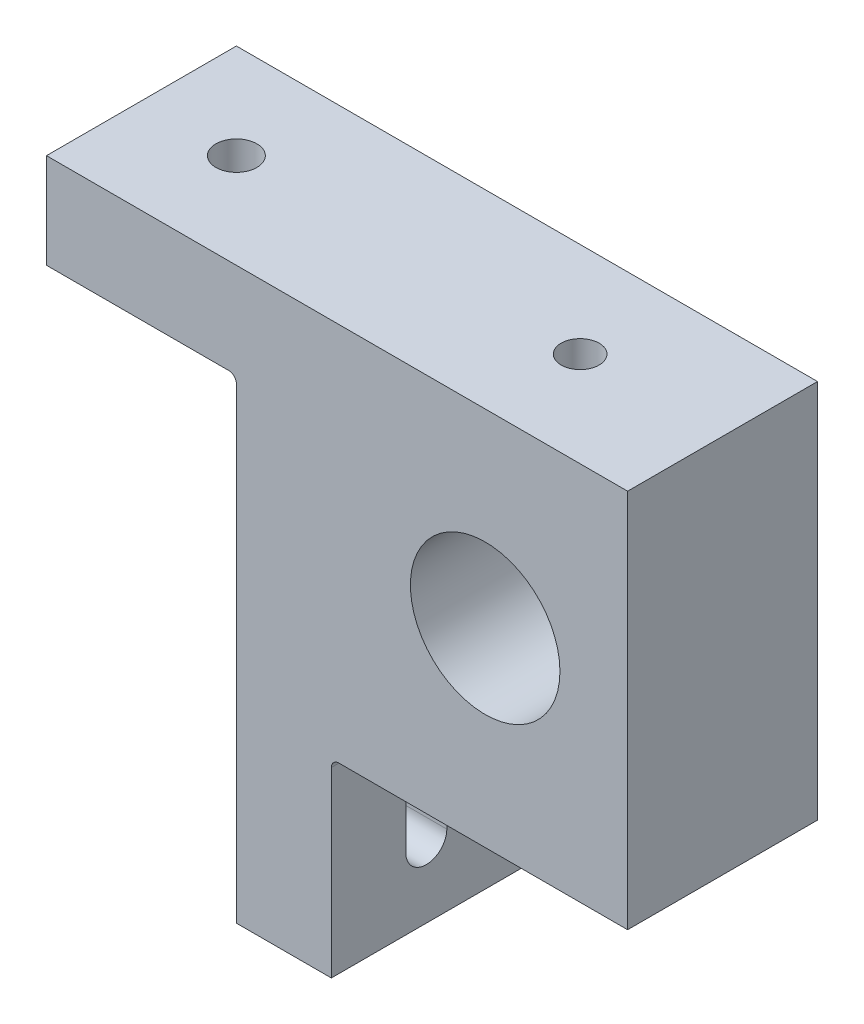
ISO-10303-21;
HEADER;
FILE_DESCRIPTION(('STEP AP214'),'2;1');
FILE_NAME('part.step','',(''),(''),'','','');
FILE_SCHEMA(('AUTOMOTIVE_DESIGN { 1 0 10303 214 1 1 1 1 }'));
ENDSEC;
DATA;
#1=APPLICATION_CONTEXT('core data for automotive mechanical design processes');
#2=APPLICATION_PROTOCOL_DEFINITION('international standard','automotive_design',2000,#1);
#3=PRODUCT_CONTEXT('',#1,'mechanical');
#4=PRODUCT('Part','Part','',(#3));
#5=PRODUCT_RELATED_PRODUCT_CATEGORY('part','',(#4));
#6=PRODUCT_DEFINITION_FORMATION('','',#4);
#7=PRODUCT_DEFINITION_CONTEXT('part definition',#1,'design');
#8=PRODUCT_DEFINITION('design','',#6,#7);
#9=PRODUCT_DEFINITION_SHAPE('','',#8);
#10=(LENGTH_UNIT() NAMED_UNIT(*) SI_UNIT(.MILLI.,.METRE.));
#11=(NAMED_UNIT(*) PLANE_ANGLE_UNIT() SI_UNIT($,.RADIAN.));
#12=(NAMED_UNIT(*) SI_UNIT($,.STERADIAN.) SOLID_ANGLE_UNIT());
#13=UNCERTAINTY_MEASURE_WITH_UNIT(LENGTH_MEASURE(1.E-05),#10,'distance_accuracy_value','');
#14=(GEOMETRIC_REPRESENTATION_CONTEXT(3) GLOBAL_UNCERTAINTY_ASSIGNED_CONTEXT((#13)) GLOBAL_UNIT_ASSIGNED_CONTEXT((#10,
#11,#12)) REPRESENTATION_CONTEXT('',''));
#15=CARTESIAN_POINT('',(0.,0.,0.));
#16=DIRECTION('',(0.,0.,1.));
#17=DIRECTION('',(1.,0.,0.));
#18=AXIS2_PLACEMENT_3D('',#15,#16,#17);
#19=CARTESIAN_POINT('',(0.,0.,25.4));
#20=DIRECTION('',(0.,0.,-1.));
#21=DIRECTION('',(-1.,0.,0.));
#22=AXIS2_PLACEMENT_3D('',#19,#20,#21);
#23=PLANE('',#22);
#24=DIRECTION('',(0.,-1.,0.));
#25=VECTOR('',#24,1.);
#26=CARTESIAN_POINT('',(-58.674,12.7,25.4));
#27=LINE('',#26,#25);
#28=CARTESIAN_POINT('',(-58.674,25.4,25.4));
#29=VERTEX_POINT('',#28);
#30=CARTESIAN_POINT('',(-58.674,12.7,25.4));
#31=VERTEX_POINT('',#30);
#32=EDGE_CURVE('E186',#29,#31,#27,.T.);
#33=ORIENTED_EDGE('',*,*,#32,.T.);
#34=DIRECTION('',(1.,0.,0.));
#35=VECTOR('',#34,1.);
#36=CARTESIAN_POINT('',(-58.674,12.7,25.4));
#37=LINE('',#36,#35);
#38=CARTESIAN_POINT('',(-34.29,12.7,25.4));
#39=VERTEX_POINT('',#38);
#40=EDGE_CURVE('E189',#31,#39,#37,.T.);
#41=ORIENTED_EDGE('',*,*,#40,.T.);
#42=CARTESIAN_POINT('',(-34.29,11.684,25.4));
#43=DIRECTION('',(0.,0.,-1.));
#44=DIRECTION('',(-1.,0.,0.));
#45=AXIS2_PLACEMENT_3D('',#42,#43,#44);
#46=CIRCLE('',#45,1.016);
#47=CARTESIAN_POINT('',(-33.274,11.684,25.4));
#48=VERTEX_POINT('',#47);
#49=EDGE_CURVE('E11',#39,#48,#46,.T.);
#50=ORIENTED_EDGE('',*,*,#49,.T.);
#51=DIRECTION('',(0.,-1.,0.));
#52=VECTOR('',#51,1.);
#53=CARTESIAN_POINT('',(-33.274,12.7,25.4));
#54=LINE('',#53,#52);
#55=CARTESIAN_POINT('',(-33.274,-50.8,25.4));
#56=VERTEX_POINT('',#55);
#57=EDGE_CURVE('E192',#48,#56,#54,.T.);
#58=ORIENTED_EDGE('',*,*,#57,.T.);
#59=DIRECTION('',(1.,0.,0.));
#60=VECTOR('',#59,1.);
#61=CARTESIAN_POINT('',(-33.274,-50.8,25.4));
#62=LINE('',#61,#60);
#63=CARTESIAN_POINT('',(-20.574,-50.8,25.4));
#64=VERTEX_POINT('',#63);
#65=EDGE_CURVE('E194',#56,#64,#62,.T.);
#66=ORIENTED_EDGE('',*,*,#65,.T.);
#67=DIRECTION('',(0.,1.,0.));
#68=VECTOR('',#67,1.);
#69=CARTESIAN_POINT('',(-20.574,-50.8,25.4));
#70=LINE('',#69,#68);
#71=CARTESIAN_POINT('',(-20.574,-26.416,25.4));
#72=VERTEX_POINT('',#71);
#73=EDGE_CURVE('E196',#64,#72,#70,.T.);
#74=ORIENTED_EDGE('',*,*,#73,.T.);
#75=CARTESIAN_POINT('',(-19.558,-26.416,25.4));
#76=DIRECTION('',(0.,0.,-1.));
#77=DIRECTION('',(-1.,0.,0.));
#78=AXIS2_PLACEMENT_3D('',#75,#76,#77);
#79=CIRCLE('',#78,1.016);
#80=CARTESIAN_POINT('',(-19.558,-25.4,25.4));
#81=VERTEX_POINT('',#80);
#82=EDGE_CURVE('E320',#72,#81,#79,.T.);
#83=ORIENTED_EDGE('',*,*,#82,.T.);
#84=DIRECTION('',(1.,0.,0.));
#85=VECTOR('',#84,1.);
#86=CARTESIAN_POINT('',(19.05,-25.4,25.4));
#87=LINE('',#86,#85);
#88=CARTESIAN_POINT('',(19.05,-25.4,25.4));
#89=VERTEX_POINT('',#88);
#90=EDGE_CURVE('E199',#81,#89,#87,.T.);
#91=ORIENTED_EDGE('',*,*,#90,.T.);
#92=DIRECTION('',(0.,1.,0.));
#93=VECTOR('',#92,1.);
#94=CARTESIAN_POINT('',(19.05,25.4,25.4));
#95=LINE('',#94,#93);
#96=CARTESIAN_POINT('',(19.05,25.4,25.4));
#97=VERTEX_POINT('',#96);
#98=EDGE_CURVE('E201',#89,#97,#95,.T.);
#99=ORIENTED_EDGE('',*,*,#98,.T.);
#100=DIRECTION('',(-1.,0.,0.));
#101=VECTOR('',#100,1.);
#102=CARTESIAN_POINT('',(-58.674,25.4,25.4));
#103=LINE('',#102,#101);
#104=EDGE_CURVE('E203',#97,#29,#103,.T.);
#105=ORIENTED_EDGE('',*,*,#104,.T.);
#106=EDGE_LOOP('',(#33,#41,#50,#58,#66,#74,#83,#91,#99,#105));
#107=FACE_BOUND('',#106,.T.);
#108=CARTESIAN_POINT('',(0.,0.,25.4));
#109=DIRECTION('',(0.,0.,1.));
#110=DIRECTION('',(1.,0.,0.));
#111=AXIS2_PLACEMENT_3D('',#108,#109,#110);
#112=CIRCLE('',#111,10.);
#113=CARTESIAN_POINT('',(10.,0.,25.4));
#114=VERTEX_POINT('',#113);
#115=EDGE_CURVE('E179',#114,#114,#112,.T.);
#116=ORIENTED_EDGE('',*,*,#115,.F.);
#117=EDGE_LOOP('',(#116));
#118=FACE_BOUND('',#117,.T.);
#119=ADVANCED_FACE('F32',(#107,#118),#23,.F.);
#120=CARTESIAN_POINT('',(0.,0.,0.));
#121=DIRECTION('',(0.,0.,-1.));
#122=DIRECTION('',(-1.,0.,0.));
#123=AXIS2_PLACEMENT_3D('',#120,#121,#122);
#124=PLANE('',#123);
#125=DIRECTION('',(0.,-1.,0.));
#126=VECTOR('',#125,1.);
#127=CARTESIAN_POINT('',(-58.674,12.7,0.));
#128=LINE('',#127,#126);
#129=CARTESIAN_POINT('',(-58.674,25.4,0.));
#130=VERTEX_POINT('',#129);
#131=CARTESIAN_POINT('',(-58.674,12.7,0.));
#132=VERTEX_POINT('',#131);
#133=EDGE_CURVE('E182',#130,#132,#128,.T.);
#134=ORIENTED_EDGE('',*,*,#133,.F.);
#135=DIRECTION('',(-1.,0.,0.));
#136=VECTOR('',#135,1.);
#137=CARTESIAN_POINT('',(-58.674,25.4,0.));
#138=LINE('',#137,#136);
#139=CARTESIAN_POINT('',(19.05,25.4,0.));
#140=VERTEX_POINT('',#139);
#141=EDGE_CURVE('E190',#140,#130,#138,.T.);
#142=ORIENTED_EDGE('',*,*,#141,.F.);
#143=DIRECTION('',(0.,1.,0.));
#144=VECTOR('',#143,1.);
#145=CARTESIAN_POINT('',(19.05,25.4,0.));
#146=LINE('',#145,#144);
#147=CARTESIAN_POINT('',(19.05,-25.4,0.));
#148=VERTEX_POINT('',#147);
#149=EDGE_CURVE('E219',#148,#140,#146,.T.);
#150=ORIENTED_EDGE('',*,*,#149,.F.);
#151=DIRECTION('',(1.,0.,0.));
#152=VECTOR('',#151,1.);
#153=CARTESIAN_POINT('',(19.05,-25.4,0.));
#154=LINE('',#153,#152);
#155=CARTESIAN_POINT('',(-19.558,-25.4,0.));
#156=VERTEX_POINT('',#155);
#157=EDGE_CURVE('E217',#156,#148,#154,.T.);
#158=ORIENTED_EDGE('',*,*,#157,.F.);
#159=CARTESIAN_POINT('',(-19.558,-26.416,0.));
#160=DIRECTION('',(0.,0.,-1.));
#161=DIRECTION('',(-1.,0.,0.));
#162=AXIS2_PLACEMENT_3D('',#159,#160,#161);
#163=CIRCLE('',#162,1.016);
#164=CARTESIAN_POINT('',(-20.574,-26.416,0.));
#165=VERTEX_POINT('',#164);
#166=EDGE_CURVE('E324',#156,#165,#163,.F.);
#167=ORIENTED_EDGE('',*,*,#166,.T.);
#168=DIRECTION('',(0.,1.,0.));
#169=VECTOR('',#168,1.);
#170=CARTESIAN_POINT('',(-20.574,-50.8,0.));
#171=LINE('',#170,#169);
#172=CARTESIAN_POINT('',(-20.574,-50.8,0.));
#173=VERTEX_POINT('',#172);
#174=EDGE_CURVE('E214',#173,#165,#171,.T.);
#175=ORIENTED_EDGE('',*,*,#174,.F.);
#176=DIRECTION('',(1.,0.,0.));
#177=VECTOR('',#176,1.);
#178=CARTESIAN_POINT('',(-33.274,-50.8,0.));
#179=LINE('',#178,#177);
#180=CARTESIAN_POINT('',(-33.274,-50.8,0.));
#181=VERTEX_POINT('',#180);
#182=EDGE_CURVE('E212',#181,#173,#179,.T.);
#183=ORIENTED_EDGE('',*,*,#182,.F.);
#184=DIRECTION('',(0.,-1.,0.));
#185=VECTOR('',#184,1.);
#186=CARTESIAN_POINT('',(-33.274,12.7,0.));
#187=LINE('',#186,#185);
#188=CARTESIAN_POINT('',(-33.274,11.684,0.));
#189=VERTEX_POINT('',#188);
#190=EDGE_CURVE('E210',#189,#181,#187,.T.);
#191=ORIENTED_EDGE('',*,*,#190,.F.);
#192=CARTESIAN_POINT('',(-34.29,11.684,0.));
#193=DIRECTION('',(0.,0.,-1.));
#194=DIRECTION('',(-1.,0.,0.));
#195=AXIS2_PLACEMENT_3D('',#192,#193,#194);
#196=CIRCLE('',#195,1.016);
#197=CARTESIAN_POINT('',(-34.29,12.7,0.));
#198=VERTEX_POINT('',#197);
#199=EDGE_CURVE('E40',#189,#198,#196,.F.);
#200=ORIENTED_EDGE('',*,*,#199,.T.);
#201=DIRECTION('',(1.,0.,0.));
#202=VECTOR('',#201,1.);
#203=CARTESIAN_POINT('',(-58.674,12.7,0.));
#204=LINE('',#203,#202);
#205=EDGE_CURVE('E208',#132,#198,#204,.T.);
#206=ORIENTED_EDGE('',*,*,#205,.F.);
#207=EDGE_LOOP('',(#134,#142,#150,#158,#167,#175,#183,#191,#200,#206));
#208=FACE_BOUND('',#207,.T.);
#209=CARTESIAN_POINT('',(0.,0.,0.));
#210=DIRECTION('',(0.,0.,1.));
#211=DIRECTION('',(1.,0.,0.));
#212=AXIS2_PLACEMENT_3D('',#209,#210,#211);
#213=CIRCLE('',#212,10.);
#214=CARTESIAN_POINT('',(10.,0.,0.));
#215=VERTEX_POINT('',#214);
#216=EDGE_CURVE('E183',#215,#215,#213,.T.);
#217=ORIENTED_EDGE('',*,*,#216,.T.);
#218=EDGE_LOOP('',(#217));
#219=FACE_BOUND('',#218,.T.);
#220=ADVANCED_FACE('F274',(#208,#219),#124,.T.);
#221=CARTESIAN_POINT('',(-58.674,12.7,25.4));
#222=DIRECTION('',(1.,0.,0.));
#223=DIRECTION('',(0.,0.,-1.));
#224=AXIS2_PLACEMENT_3D('',#221,#222,#223);
#225=PLANE('',#224);
#226=ORIENTED_EDGE('',*,*,#133,.T.);
#227=DIRECTION('',(0.,0.,-1.));
#228=VECTOR('',#227,1.);
#229=CARTESIAN_POINT('',(-58.674,12.7,25.4));
#230=LINE('',#229,#228);
#231=EDGE_CURVE('E236',#31,#132,#230,.T.);
#232=ORIENTED_EDGE('',*,*,#231,.F.);
#233=ORIENTED_EDGE('',*,*,#32,.F.);
#234=DIRECTION('',(0.,0.,-1.));
#235=VECTOR('',#234,1.);
#236=CARTESIAN_POINT('',(-58.674,25.4,25.4));
#237=LINE('',#236,#235);
#238=EDGE_CURVE('E205',#29,#130,#237,.T.);
#239=ORIENTED_EDGE('',*,*,#238,.T.);
#240=EDGE_LOOP('',(#226,#232,#233,#239));
#241=FACE_BOUND('',#240,.T.);
#242=ADVANCED_FACE('F279',(#241),#225,.F.);
#243=CARTESIAN_POINT('',(-58.674,12.7,25.4));
#244=DIRECTION('',(0.,1.,0.));
#245=DIRECTION('',(0.,0.,1.));
#246=AXIS2_PLACEMENT_3D('',#243,#244,#245);
#247=PLANE('',#246);
#248=CARTESIAN_POINT('',(-45.974,12.7,12.7));
#249=DIRECTION('',(0.,1.,0.));
#250=DIRECTION('',(0.,0.,1.));
#251=AXIS2_PLACEMENT_3D('',#248,#249,#250);
#252=CIRCLE('',#251,2.7432);
#253=CARTESIAN_POINT('',(-45.974,12.7,15.4432));
#254=VERTEX_POINT('',#253);
#255=EDGE_CURVE('E172',#254,#254,#252,.T.);
#256=ORIENTED_EDGE('',*,*,#255,.T.);
#257=EDGE_LOOP('',(#256));
#258=FACE_BOUND('',#257,.T.);
#259=ORIENTED_EDGE('',*,*,#205,.T.);
#260=DIRECTION('',(0.,0.,-1.));
#261=VECTOR('',#260,1.);
#262=CARTESIAN_POINT('',(-34.29,12.7,25.4));
#263=LINE('',#262,#261);
#264=EDGE_CURVE('E47',#198,#39,#263,.F.);
#265=ORIENTED_EDGE('',*,*,#264,.T.);
#266=ORIENTED_EDGE('',*,*,#40,.F.);
#267=ORIENTED_EDGE('',*,*,#231,.T.);
#268=EDGE_LOOP('',(#259,#265,#266,#267));
#269=FACE_BOUND('',#268,.T.);
#270=ADVANCED_FACE('F304',(#258,#269),#247,.F.);
#271=CARTESIAN_POINT('',(-33.274,12.7,25.4));
#272=DIRECTION('',(1.,0.,0.));
#273=DIRECTION('',(0.,1.,0.));
#274=AXIS2_PLACEMENT_3D('',#271,#272,#273);
#275=PLANE('',#274);
#276=DIRECTION('',(0.,-1.,0.));
#277=VECTOR('',#276,1.);
#278=CARTESIAN_POINT('',(-33.274,-34.925,9.95680000000001));
#279=LINE('',#278,#277);
#280=CARTESIAN_POINT('',(-33.274,-34.925,9.95680000000001));
#281=VERTEX_POINT('',#280);
#282=CARTESIAN_POINT('',(-33.274,-41.275,9.9568));
#283=VERTEX_POINT('',#282);
#284=EDGE_CURVE('E476',#281,#283,#279,.T.);
#285=ORIENTED_EDGE('',*,*,#284,.F.);
#286=CARTESIAN_POINT('',(-33.274,-34.925,12.7));
#287=DIRECTION('',(1.,0.,0.));
#288=DIRECTION('',(0.,1.,0.));
#289=AXIS2_PLACEMENT_3D('',#286,#287,#288);
#290=CIRCLE('',#289,2.7432);
#291=CARTESIAN_POINT('',(-33.274,-34.925,15.4432));
#292=VERTEX_POINT('',#291);
#293=EDGE_CURVE('E169',#292,#281,#290,.F.);
#294=ORIENTED_EDGE('',*,*,#293,.F.);
#295=DIRECTION('',(0.,1.,0.));
#296=VECTOR('',#295,1.);
#297=CARTESIAN_POINT('',(-33.274,-34.925,15.4432));
#298=LINE('',#297,#296);
#299=CARTESIAN_POINT('',(-33.274,-41.275,15.4432));
#300=VERTEX_POINT('',#299);
#301=EDGE_CURVE('E166',#300,#292,#298,.T.);
#302=ORIENTED_EDGE('',*,*,#301,.F.);
#303=CARTESIAN_POINT('',(-33.274,-41.275,12.7));
#304=DIRECTION('',(1.,0.,0.));
#305=DIRECTION('',(0.,1.,0.));
#306=AXIS2_PLACEMENT_3D('',#303,#304,#305);
#307=CIRCLE('',#306,2.7432);
#308=EDGE_CURVE('E139',#283,#300,#307,.F.);
#309=ORIENTED_EDGE('',*,*,#308,.F.);
#310=EDGE_LOOP('',(#285,#294,#302,#309));
#311=FACE_BOUND('',#310,.T.);
#312=ORIENTED_EDGE('',*,*,#57,.F.);
#313=DIRECTION('',(0.,0.,-1.));
#314=VECTOR('',#313,1.);
#315=CARTESIAN_POINT('',(-33.274,11.684,0.));
#316=LINE('',#315,#314);
#317=EDGE_CURVE('E329',#48,#189,#316,.T.);
#318=ORIENTED_EDGE('',*,*,#317,.T.);
#319=ORIENTED_EDGE('',*,*,#190,.T.);
#320=DIRECTION('',(0.,0.,-1.));
#321=VECTOR('',#320,1.);
#322=CARTESIAN_POINT('',(-33.274,-50.8,25.4));
#323=LINE('',#322,#321);
#324=EDGE_CURVE('E233',#56,#181,#323,.T.);
#325=ORIENTED_EDGE('',*,*,#324,.F.);
#326=EDGE_LOOP('',(#312,#318,#319,#325));
#327=FACE_BOUND('',#326,.T.);
#328=ADVANCED_FACE('F300',(#311,#327),#275,.F.);
#329=CARTESIAN_POINT('',(-33.274,-50.8,25.4));
#330=DIRECTION('',(0.,1.,0.));
#331=DIRECTION('',(0.,0.,1.));
#332=AXIS2_PLACEMENT_3D('',#329,#330,#331);
#333=PLANE('',#332);
#334=ORIENTED_EDGE('',*,*,#182,.T.);
#335=DIRECTION('',(0.,0.,-1.));
#336=VECTOR('',#335,1.);
#337=CARTESIAN_POINT('',(-20.574,-50.8,25.4));
#338=LINE('',#337,#336);
#339=EDGE_CURVE('E230',#64,#173,#338,.T.);
#340=ORIENTED_EDGE('',*,*,#339,.F.);
#341=ORIENTED_EDGE('',*,*,#65,.F.);
#342=ORIENTED_EDGE('',*,*,#324,.T.);
#343=EDGE_LOOP('',(#334,#340,#341,#342));
#344=FACE_BOUND('',#343,.T.);
#345=ADVANCED_FACE('F297',(#344),#333,.F.);
#346=CARTESIAN_POINT('',(-20.574,-50.8,25.4));
#347=DIRECTION('',(-1.,0.,0.));
#348=DIRECTION('',(0.,0.,1.));
#349=AXIS2_PLACEMENT_3D('',#346,#347,#348);
#350=PLANE('',#349);
#351=DIRECTION('',(0.,-1.,0.));
#352=VECTOR('',#351,1.);
#353=CARTESIAN_POINT('',(-20.574,-34.925,15.4432));
#354=LINE('',#353,#352);
#355=CARTESIAN_POINT('',(-20.574,-34.925,15.4432));
#356=VERTEX_POINT('',#355);
#357=CARTESIAN_POINT('',(-20.574,-41.275,15.4432));
#358=VERTEX_POINT('',#357);
#359=EDGE_CURVE('E147',#356,#358,#354,.T.);
#360=ORIENTED_EDGE('',*,*,#359,.F.);
#361=CARTESIAN_POINT('',(-20.574,-34.925,12.7));
#362=DIRECTION('',(1.,0.,0.));
#363=DIRECTION('',(0.,1.,0.));
#364=AXIS2_PLACEMENT_3D('',#361,#362,#363);
#365=CIRCLE('',#364,2.7432);
#366=CARTESIAN_POINT('',(-20.574,-34.925,9.95680000000001));
#367=VERTEX_POINT('',#366);
#368=EDGE_CURVE('E152',#367,#356,#365,.T.);
#369=ORIENTED_EDGE('',*,*,#368,.F.);
#370=DIRECTION('',(0.,1.,0.));
#371=VECTOR('',#370,1.);
#372=CARTESIAN_POINT('',(-20.574,-34.925,9.95680000000001));
#373=LINE('',#372,#371);
#374=CARTESIAN_POINT('',(-20.574,-41.275,9.9568));
#375=VERTEX_POINT('',#374);
#376=EDGE_CURVE('E157',#375,#367,#373,.T.);
#377=ORIENTED_EDGE('',*,*,#376,.F.);
#378=CARTESIAN_POINT('',(-20.574,-41.275,12.7));
#379=DIRECTION('',(1.,0.,0.));
#380=DIRECTION('',(0.,1.,0.));
#381=AXIS2_PLACEMENT_3D('',#378,#379,#380);
#382=CIRCLE('',#381,2.7432);
#383=EDGE_CURVE('E136',#358,#375,#382,.T.);
#384=ORIENTED_EDGE('',*,*,#383,.F.);
#385=EDGE_LOOP('',(#360,#369,#377,#384));
#386=FACE_BOUND('',#385,.T.);
#387=ORIENTED_EDGE('',*,*,#174,.T.);
#388=DIRECTION('',(0.,0.,-1.));
#389=VECTOR('',#388,1.);
#390=CARTESIAN_POINT('',(-20.574,-26.416,25.4));
#391=LINE('',#390,#389);
#392=EDGE_CURVE('E321',#165,#72,#391,.F.);
#393=ORIENTED_EDGE('',*,*,#392,.T.);
#394=ORIENTED_EDGE('',*,*,#73,.F.);
#395=ORIENTED_EDGE('',*,*,#339,.T.);
#396=EDGE_LOOP('',(#387,#393,#394,#395));
#397=FACE_BOUND('',#396,.T.);
#398=ADVANCED_FACE('F154',(#386,#397),#350,.F.);
#399=CARTESIAN_POINT('',(19.05,-25.4,25.4));
#400=DIRECTION('',(0.,1.,0.));
#401=DIRECTION('',(-1.,0.,0.));
#402=AXIS2_PLACEMENT_3D('',#399,#400,#401);
#403=PLANE('',#402);
#404=ORIENTED_EDGE('',*,*,#90,.F.);
#405=DIRECTION('',(0.,0.,-1.));
#406=VECTOR('',#405,1.);
#407=CARTESIAN_POINT('',(-19.558,-25.4,0.));
#408=LINE('',#407,#406);
#409=EDGE_CURVE('E239',#81,#156,#408,.T.);
#410=ORIENTED_EDGE('',*,*,#409,.T.);
#411=ORIENTED_EDGE('',*,*,#157,.T.);
#412=DIRECTION('',(0.,0.,-1.));
#413=VECTOR('',#412,1.);
#414=CARTESIAN_POINT('',(19.05,-25.4,25.4));
#415=LINE('',#414,#413);
#416=EDGE_CURVE('E227',#89,#148,#415,.T.);
#417=ORIENTED_EDGE('',*,*,#416,.F.);
#418=EDGE_LOOP('',(#404,#410,#411,#417));
#419=FACE_BOUND('',#418,.T.);
#420=ADVANCED_FACE('F290',(#419),#403,.F.);
#421=CARTESIAN_POINT('',(19.05,25.4,25.4));
#422=DIRECTION('',(-1.,0.,0.));
#423=DIRECTION('',(0.,-1.,0.));
#424=AXIS2_PLACEMENT_3D('',#421,#422,#423);
#425=PLANE('',#424);
#426=ORIENTED_EDGE('',*,*,#149,.T.);
#427=DIRECTION('',(0.,0.,-1.));
#428=VECTOR('',#427,1.);
#429=CARTESIAN_POINT('',(19.05,25.4,25.4));
#430=LINE('',#429,#428);
#431=EDGE_CURVE('E224',#97,#140,#430,.T.);
#432=ORIENTED_EDGE('',*,*,#431,.F.);
#433=ORIENTED_EDGE('',*,*,#98,.F.);
#434=ORIENTED_EDGE('',*,*,#416,.T.);
#435=EDGE_LOOP('',(#426,#432,#433,#434));
#436=FACE_BOUND('',#435,.T.);
#437=ADVANCED_FACE('F286',(#436),#425,.F.);
#438=CARTESIAN_POINT('',(-58.674,25.4,25.4));
#439=DIRECTION('',(0.,-1.,0.));
#440=DIRECTION('',(1.,0.,0.));
#441=AXIS2_PLACEMENT_3D('',#438,#439,#440);
#442=PLANE('',#441);
#443=CARTESIAN_POINT('',(-45.974,25.4,12.7));
#444=DIRECTION('',(0.,1.,0.));
#445=DIRECTION('',(-1.,0.,0.));
#446=AXIS2_PLACEMENT_3D('',#443,#444,#445);
#447=CIRCLE('',#446,2.7432);
#448=CARTESIAN_POINT('',(-48.7172,25.4,12.7));
#449=VERTEX_POINT('',#448);
#450=EDGE_CURVE('E168',#449,#449,#447,.T.);
#451=ORIENTED_EDGE('',*,*,#450,.F.);
#452=EDGE_LOOP('',(#451));
#453=FACE_BOUND('',#452,.T.);
#454=CARTESIAN_POINT('',(0.,25.4,12.7));
#455=DIRECTION('',(0.,1.,0.));
#456=DIRECTION('',(-1.,0.,0.));
#457=AXIS2_PLACEMENT_3D('',#454,#455,#456);
#458=CIRCLE('',#457,2.54);
#459=CARTESIAN_POINT('',(-2.54,25.4,12.7));
#460=VERTEX_POINT('',#459);
#461=EDGE_CURVE('E175',#460,#460,#458,.T.);
#462=ORIENTED_EDGE('',*,*,#461,.F.);
#463=EDGE_LOOP('',(#462));
#464=FACE_BOUND('',#463,.T.);
#465=ORIENTED_EDGE('',*,*,#141,.T.);
#466=ORIENTED_EDGE('',*,*,#238,.F.);
#467=ORIENTED_EDGE('',*,*,#104,.F.);
#468=ORIENTED_EDGE('',*,*,#431,.T.);
#469=EDGE_LOOP('',(#465,#466,#467,#468));
#470=FACE_BOUND('',#469,.T.);
#471=ADVANCED_FACE('F283',(#453,#464,#470),#442,.F.);
#472=CARTESIAN_POINT('',(0.,0.,25.4));
#473=DIRECTION('',(0.,0.,-1.));
#474=DIRECTION('',(-1.,0.,0.));
#475=AXIS2_PLACEMENT_3D('',#472,#473,#474);
#476=CYLINDRICAL_SURFACE('',#475,10.);
#477=CARTESIAN_POINT('',(-2.54,9.67204218353084,12.7));
#478=CARTESIAN_POINT('',(-2.53999615138223,9.67204481241555,12.5598190447217));
#479=CARTESIAN_POINT('',(-2.52835572481656,9.67512302366167,12.419595953355));
#480=CARTESIAN_POINT('',(-2.482179085287,9.68707057351804,12.1431818904365));
#481=CARTESIAN_POINT('',(-2.4476299818138,9.69594317253644,12.0069932341233));
#482=CARTESIAN_POINT('',(-2.35683069120507,9.71841125114016,11.7426862897258));
#483=CARTESIAN_POINT('',(-2.30060910170821,9.73200050458344,11.6145576242645));
#484=CARTESIAN_POINT('',(-2.16814846601408,9.76236293211248,11.3695355477072));
#485=CARTESIAN_POINT('',(-2.09190840235695,9.77913626802054,11.2526427080963));
#486=CARTESIAN_POINT('',(-1.91972514938976,9.8144034479747,11.0307558910059));
#487=CARTESIAN_POINT('',(-1.82341031462194,9.83292549919045,10.926054734146));
#488=CARTESIAN_POINT('',(-1.61461175708815,9.86935873982999,10.7341051309149));
#489=CARTESIAN_POINT('',(-1.50212648691472,9.88726987058942,10.6468583567299));
#490=CARTESIAN_POINT('',(-1.26216832936534,9.92077588125838,10.4910907049629));
#491=CARTESIAN_POINT('',(-1.13450254333524,9.93633359616224,10.4228582987168));
#492=CARTESIAN_POINT('',(-0.869051728198188,9.96305760794093,10.3089332351139));
#493=CARTESIAN_POINT('',(-0.731268245522972,9.97422457426531,10.2632371414157));
#494=CARTESIAN_POINT('',(-0.452546780152316,9.99070945836786,10.196622057634));
#495=CARTESIAN_POINT('',(-0.311734747535318,9.99614464425555,10.1752056078951));
#496=CARTESIAN_POINT('',(-0.0284186046861884,10.0009625390579,10.1561954043243));
#497=CARTESIAN_POINT('',(0.114085244324193,10.0003461705182,10.1585980193313));
#498=CARTESIAN_POINT('',(0.393286798573236,9.99321737679634,10.1868017117536));
#499=CARTESIAN_POINT('',(0.530042734325852,9.98684029236176,10.2120657130725));
#500=CARTESIAN_POINT('',(0.797306720448227,9.9690646840699,10.2844107145023));
#501=CARTESIAN_POINT('',(0.927814431906411,9.95766588816999,10.331492896583));
#502=CARTESIAN_POINT('',(1.18028197855422,9.93092207553094,10.4465669032141));
#503=CARTESIAN_POINT('',(1.30215154043221,9.9155415183076,10.5147481845742));
#504=CARTESIAN_POINT('',(1.53290641441101,9.88249996066785,10.6699408665942));
#505=CARTESIAN_POINT('',(1.64178939735325,9.86483855235754,10.7569556372098));
#506=CARTESIAN_POINT('',(1.84668409487907,9.82857562094265,10.9502178632123));
#507=CARTESIAN_POINT('',(1.94225159196694,9.80996161730511,11.0569344455239));
#508=CARTESIAN_POINT('',(2.11423534512128,9.77434112078026,11.2850737740313));
#509=CARTESIAN_POINT('',(2.19065064573479,9.75733470811781,11.4064972534677));
#510=CARTESIAN_POINT('',(2.32245770779289,9.72680893062906,11.6614964273891));
#511=CARTESIAN_POINT('',(2.37773931176618,9.71330795156388,11.7951314151049));
#512=CARTESIAN_POINT('',(2.46491167751093,9.69155565136779,12.0702248474838));
#513=CARTESIAN_POINT('',(2.49680762867648,9.68330316562369,12.211681548972));
#514=CARTESIAN_POINT('',(2.53555953807801,9.67322753639982,12.4942751731545));
#515=CARTESIAN_POINT('',(2.54307366825387,9.67123544530881,12.6353159225278));
#516=CARTESIAN_POINT('',(2.53465322150866,9.67344572634505,12.9166368125075));
#517=CARTESIAN_POINT('',(2.51872088092926,9.67764750769625,13.0569170243736));
#518=CARTESIAN_POINT('',(2.46443760054117,9.6916098958754,13.3302693950764));
#519=CARTESIAN_POINT('',(2.42647276364028,9.70127469342588,13.4634235903939));
#520=CARTESIAN_POINT('',(2.32963167210079,9.72498255331787,13.7214771345172));
#521=CARTESIAN_POINT('',(2.27075287930782,9.73902614705248,13.8463754791953));
#522=CARTESIAN_POINT('',(2.13238738365126,9.77026284758221,14.0871524090368));
#523=CARTESIAN_POINT('',(2.05250882067252,9.78751378827227,14.2027981360588));
#524=CARTESIAN_POINT('',(1.87490442500153,9.82308092978531,14.4192858479206));
#525=CARTESIAN_POINT('',(1.77717556049819,9.84139731120894,14.5201253127123));
#526=CARTESIAN_POINT('',(1.56361854545023,9.87760624473655,14.7068196362442));
#527=CARTESIAN_POINT('',(1.44738690483036,9.89547550377032,14.7922183215323));
#528=CARTESIAN_POINT('',(1.20185193040789,9.92828633904401,14.9422866783898));
#529=CARTESIAN_POINT('',(1.07254928407182,9.94322806913532,15.0069574393943));
#530=CARTESIAN_POINT('',(0.805442464417558,9.9684054209962,15.1131641901322));
#531=CARTESIAN_POINT('',(0.667708543983504,9.97867516209285,15.1548683912891));
#532=CARTESIAN_POINT('',(0.386890911557004,9.99350098372563,15.2144595302801));
#533=CARTESIAN_POINT('',(0.243808273494934,9.99805820495912,15.2323512231291));
#534=CARTESIAN_POINT('',(-0.039365362426539,10.0008972327897,15.2435347970716));
#535=CARTESIAN_POINT('',(-0.179428487666175,9.99935053074075,15.2374989081656));
#536=CARTESIAN_POINT('',(-0.456475743301818,9.99053755823046,15.2025433346249));
#537=CARTESIAN_POINT('',(-0.593459970583212,9.98327146800415,15.1736243711041));
#538=CARTESIAN_POINT('',(-0.859732596204992,9.96386446039084,15.0940888432711));
#539=CARTESIAN_POINT('',(-0.989060533492586,9.95175166532473,15.0435973379709));
#540=CARTESIAN_POINT('',(-1.2374824862401,9.92392457953076,14.9224629094399));
#541=CARTESIAN_POINT('',(-1.35657517313247,9.90820982222481,14.8518173752783));
#542=CARTESIAN_POINT('',(-1.58432008924169,9.87438716623291,14.6903495172235));
#543=CARTESIAN_POINT('',(-1.69264332600918,9.85622989755976,14.5990735069568));
#544=CARTESIAN_POINT('',(-1.89266349422052,9.81978532445282,14.3998117380846));
#545=CARTESIAN_POINT('',(-1.98435616840439,9.80149798796451,14.2918217139318));
#546=CARTESIAN_POINT('',(-2.15026444399509,9.76645836343992,14.05967280471));
#547=CARTESIAN_POINT('',(-2.22410600617186,9.74974278861009,13.9352406166923));
#548=CARTESIAN_POINT('',(-2.34971282162937,9.7202387544144,13.6753207072615));
#549=CARTESIAN_POINT('',(-2.40149376279956,9.70744750617418,13.5398409240424));
#550=CARTESIAN_POINT('',(-2.47401694297395,9.6891877094172,13.2872152250287));
#551=CARTESIAN_POINT('',(-2.49870569818162,9.6828073581073,13.1712526535712));
#552=CARTESIAN_POINT('',(-2.53169810307601,9.67423367604372,12.9368699324112));
#553=CARTESIAN_POINT('',(-2.54000325200243,9.67203996217762,12.8184500085796));
#554=CARTESIAN_POINT('',(-2.54,9.67204218353084,12.7));
#555=B_SPLINE_CURVE_WITH_KNOTS('',3,(#477,#478,#479,#480,#481,#482,#483,#484,#485,#486,#487,
#488,#489,#490,#491,#492,#493,#494,#495,#496,#497,#498,#499,#500,#501,#502,#503,#504,#505,#506,
#507,#508,#509,#510,#511,#512,#513,#514,#515,#516,#517,#518,#519,#520,#521,#522,#523,#524,#525,
#526,#527,#528,#529,#530,#531,#532,#533,#534,#535,#536,#537,#538,#539,#540,#541,#542,#543,#544,
#545,#546,#547,#548,#549,#550,#551,#552,#553,#554),.UNSPECIFIED.,.T.,.F.,(4,2,2,2,2,2,2,2,2,2,2,
2,2,2,2,2,2,2,2,2,2,2,2,2,2,2,2,2,2,2,2,2,2,2,2,2,2,2,4),(0.,0.420107748746877,
0.840452089228876,1.26024365818354,1.68005656761484,2.10846984952852,2.53692415518257,
2.9715628654858,3.40613528148481,3.83163314021272,4.25706613377711,4.67275686829241,
5.08847012491194,5.50803020389017,5.9276654186792,6.35901628453716,6.79038866507965,
7.22397983488825,7.65747475948865,8.07916593510204,8.50081689210699,8.91529276270165,
9.32981895201083,9.75270959412958,10.1756721296439,10.6095983527855,11.0435017655396,
11.4741834241956,11.9047790690181,12.3233643369094,12.7419364144533,13.1581142111951,
13.5743459477841,14.0008192081726,14.427401487895,14.8622690869875,15.296826921978,
15.6518417711679,16.0068241319645),.UNSPECIFIED.);
#556=CARTESIAN_POINT('',(-2.54,9.67204218353084,12.7));
#557=VERTEX_POINT('',#556);
#558=EDGE_CURVE('E178',#557,#557,#555,.T.);
#559=ORIENTED_EDGE('',*,*,#558,.F.);
#560=EDGE_LOOP('',(#559));
#561=FACE_BOUND('',#560,.T.);
#562=ORIENTED_EDGE('',*,*,#115,.T.);
#563=EDGE_LOOP('',(#562));
#564=FACE_BOUND('',#563,.T.);
#565=ORIENTED_EDGE('',*,*,#216,.F.);
#566=EDGE_LOOP('',(#565));
#567=FACE_BOUND('',#566,.T.);
#568=ADVANCED_FACE('F247',(#561,#564,#567),#476,.F.);
#569=CARTESIAN_POINT('',(0.,-7.75894128860373,12.7));
#570=DIRECTION('',(0.,1.,0.));
#571=DIRECTION('',(-1.,0.,0.));
#572=AXIS2_PLACEMENT_3D('',#569,#570,#571);
#573=CYLINDRICAL_SURFACE('',#572,2.54);
#574=ORIENTED_EDGE('',*,*,#558,.T.);
#575=EDGE_LOOP('',(#574));
#576=FACE_BOUND('',#575,.T.);
#577=ORIENTED_EDGE('',*,*,#461,.T.);
#578=EDGE_LOOP('',(#577));
#579=FACE_BOUND('',#578,.T.);
#580=ADVANCED_FACE('F250',(#576,#579),#573,.F.);
#581=CARTESIAN_POINT('',(-45.974,-7.75894128860374,12.7));
#582=DIRECTION('',(0.,1.,0.));
#583=DIRECTION('',(-1.,0.,0.));
#584=AXIS2_PLACEMENT_3D('',#581,#582,#583);
#585=CYLINDRICAL_SURFACE('',#584,2.7432);
#586=ORIENTED_EDGE('',*,*,#450,.T.);
#587=EDGE_LOOP('',(#586));
#588=FACE_BOUND('',#587,.T.);
#589=ORIENTED_EDGE('',*,*,#255,.F.);
#590=EDGE_LOOP('',(#589));
#591=FACE_BOUND('',#590,.T.);
#592=ADVANCED_FACE('F254',(#588,#591),#585,.F.);
#593=CARTESIAN_POINT('',(-46.3201086121494,-34.925,12.7));
#594=DIRECTION('',(1.,0.,0.));
#595=DIRECTION('',(0.,1.,0.));
#596=AXIS2_PLACEMENT_3D('',#593,#594,#595);
#597=CYLINDRICAL_SURFACE('',#596,2.7432);
#598=ORIENTED_EDGE('',*,*,#293,.T.);
#599=DIRECTION('',(1.,0.,0.));
#600=VECTOR('',#599,1.);
#601=CARTESIAN_POINT('',(-46.3201086121494,-34.925,9.95680000000001));
#602=LINE('',#601,#600);
#603=EDGE_CURVE('E162',#281,#367,#602,.T.);
#604=ORIENTED_EDGE('',*,*,#603,.T.);
#605=ORIENTED_EDGE('',*,*,#368,.T.);
#606=DIRECTION('',(1.,0.,0.));
#607=VECTOR('',#606,1.);
#608=CARTESIAN_POINT('',(-46.3201086121494,-34.925,15.4432));
#609=LINE('',#608,#607);
#610=EDGE_CURVE('E143',#292,#356,#609,.T.);
#611=ORIENTED_EDGE('',*,*,#610,.F.);
#612=EDGE_LOOP('',(#598,#604,#605,#611));
#613=FACE_BOUND('',#612,.T.);
#614=ADVANCED_FACE('F258',(#613),#597,.F.);
#615=CARTESIAN_POINT('',(-46.3201086121494,-34.925,9.95680000000001));
#616=DIRECTION('',(0.,0.,-1.));
#617=DIRECTION('',(0.,1.,0.));
#618=AXIS2_PLACEMENT_3D('',#615,#616,#617);
#619=PLANE('',#618);
#620=ORIENTED_EDGE('',*,*,#284,.T.);
#621=DIRECTION('',(1.,0.,0.));
#622=VECTOR('',#621,1.);
#623=CARTESIAN_POINT('',(-46.3201086121494,-41.275,9.9568));
#624=LINE('',#623,#622);
#625=EDGE_CURVE('E142',#283,#375,#624,.T.);
#626=ORIENTED_EDGE('',*,*,#625,.T.);
#627=ORIENTED_EDGE('',*,*,#376,.T.);
#628=ORIENTED_EDGE('',*,*,#603,.F.);
#629=EDGE_LOOP('',(#620,#626,#627,#628));
#630=FACE_BOUND('',#629,.T.);
#631=ADVANCED_FACE('F262',(#630),#619,.F.);
#632=CARTESIAN_POINT('',(-46.3201086121494,-41.275,12.7));
#633=DIRECTION('',(1.,0.,0.));
#634=DIRECTION('',(0.,1.,0.));
#635=AXIS2_PLACEMENT_3D('',#632,#633,#634);
#636=CYLINDRICAL_SURFACE('',#635,2.7432);
#637=ORIENTED_EDGE('',*,*,#308,.T.);
#638=DIRECTION('',(1.,0.,0.));
#639=VECTOR('',#638,1.);
#640=CARTESIAN_POINT('',(-46.3201086121494,-41.275,15.4432));
#641=LINE('',#640,#639);
#642=EDGE_CURVE('E131',#300,#358,#641,.T.);
#643=ORIENTED_EDGE('',*,*,#642,.T.);
#644=ORIENTED_EDGE('',*,*,#383,.T.);
#645=ORIENTED_EDGE('',*,*,#625,.F.);
#646=EDGE_LOOP('',(#637,#643,#644,#645));
#647=FACE_BOUND('',#646,.T.);
#648=ADVANCED_FACE('F133',(#647),#636,.F.);
#649=CARTESIAN_POINT('',(-46.3201086121494,-34.925,15.4432));
#650=DIRECTION('',(0.,0.,1.));
#651=DIRECTION('',(0.,-1.,0.));
#652=AXIS2_PLACEMENT_3D('',#649,#650,#651);
#653=PLANE('',#652);
#654=ORIENTED_EDGE('',*,*,#301,.T.);
#655=ORIENTED_EDGE('',*,*,#610,.T.);
#656=ORIENTED_EDGE('',*,*,#359,.T.);
#657=ORIENTED_EDGE('',*,*,#642,.F.);
#658=EDGE_LOOP('',(#654,#655,#656,#657));
#659=FACE_BOUND('',#658,.T.);
#660=ADVANCED_FACE('F148',(#659),#653,.F.);
#661=CARTESIAN_POINT('',(-19.558,-26.416,25.4));
#662=DIRECTION('',(0.,0.,1.));
#663=DIRECTION('',(1.,0.,0.));
#664=AXIS2_PLACEMENT_3D('',#661,#662,#663);
#665=CYLINDRICAL_SURFACE('',#664,1.016);
#666=ORIENTED_EDGE('',*,*,#82,.F.);
#667=ORIENTED_EDGE('',*,*,#392,.F.);
#668=ORIENTED_EDGE('',*,*,#166,.F.);
#669=ORIENTED_EDGE('',*,*,#409,.F.);
#670=EDGE_LOOP('',(#666,#667,#668,#669));
#671=FACE_BOUND('',#670,.T.);
#672=ADVANCED_FACE('F266',(#671),#665,.F.);
#673=CARTESIAN_POINT('',(-34.29,11.684,25.4));
#674=DIRECTION('',(0.,0.,1.));
#675=DIRECTION('',(1.,0.,0.));
#676=AXIS2_PLACEMENT_3D('',#673,#674,#675);
#677=CYLINDRICAL_SURFACE('',#676,1.016);
#678=ORIENTED_EDGE('',*,*,#49,.F.);
#679=ORIENTED_EDGE('',*,*,#264,.F.);
#680=ORIENTED_EDGE('',*,*,#199,.F.);
#681=ORIENTED_EDGE('',*,*,#317,.F.);
#682=EDGE_LOOP('',(#678,#679,#680,#681));
#683=FACE_BOUND('',#682,.T.);
#684=ADVANCED_FACE('F34',(#683),#677,.F.);
#685=CLOSED_SHELL('',(#119,#220,#242,#270,#328,#345,#398,#420,#437,#471,#568,#580,#592,#614,
#631,#648,#660,#672,#684));
#686=MANIFOLD_SOLID_BREP('B2',#685);
#687=ADVANCED_BREP_SHAPE_REPRESENTATION('',(#18,#686),#14);
#688=SHAPE_DEFINITION_REPRESENTATION(#9,#687);
ENDSEC;
END-ISO-10303-21;
